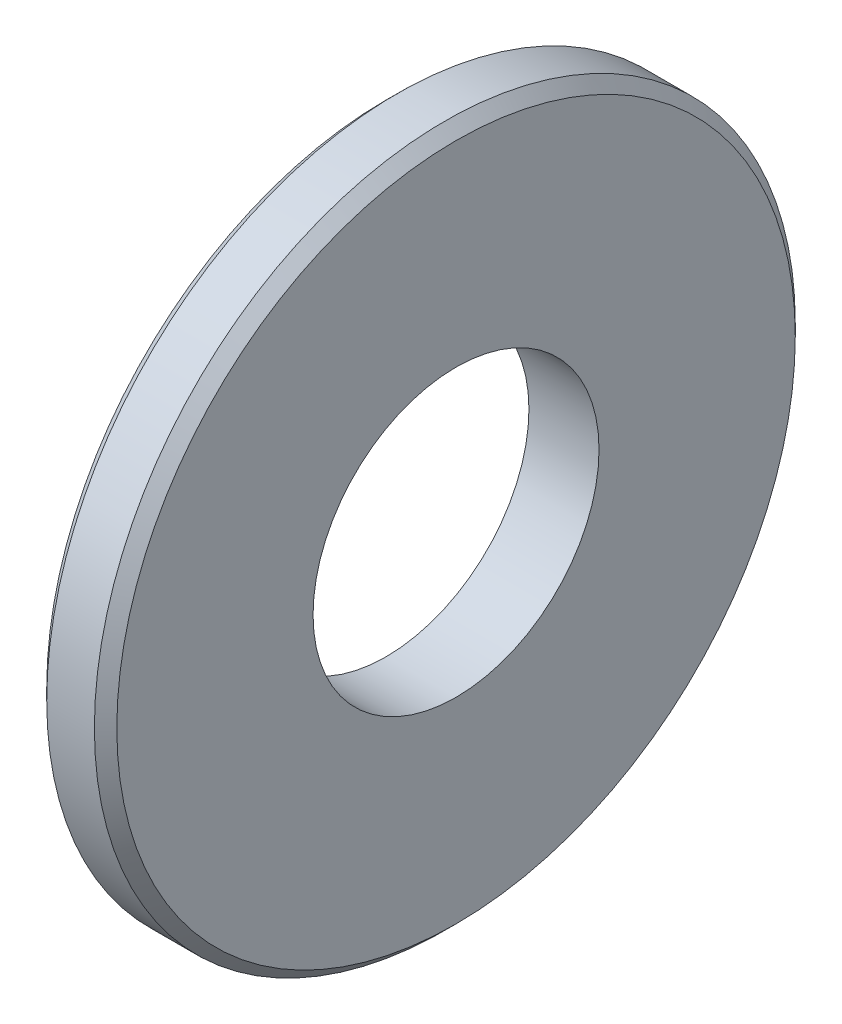
ISO-10303-21;
HEADER;
FILE_DESCRIPTION(('STEP AP214'),'2;1');
FILE_NAME('part.step','',(''),(''),'','','');
FILE_SCHEMA(('AUTOMOTIVE_DESIGN { 1 0 10303 214 1 1 1 1 }'));
ENDSEC;
DATA;
#1=APPLICATION_CONTEXT('core data for automotive mechanical design processes');
#2=APPLICATION_PROTOCOL_DEFINITION('international standard','automotive_design',2000,#1);
#3=PRODUCT_CONTEXT('',#1,'mechanical');
#4=PRODUCT('Part','Part','',(#3));
#5=PRODUCT_RELATED_PRODUCT_CATEGORY('part','',(#4));
#6=PRODUCT_DEFINITION_FORMATION('','',#4);
#7=PRODUCT_DEFINITION_CONTEXT('part definition',#1,'design');
#8=PRODUCT_DEFINITION('design','',#6,#7);
#9=PRODUCT_DEFINITION_SHAPE('','',#8);
#10=(LENGTH_UNIT() NAMED_UNIT(*) SI_UNIT(.MILLI.,.METRE.));
#11=(NAMED_UNIT(*) PLANE_ANGLE_UNIT() SI_UNIT($,.RADIAN.));
#12=(NAMED_UNIT(*) SI_UNIT($,.STERADIAN.) SOLID_ANGLE_UNIT());
#13=UNCERTAINTY_MEASURE_WITH_UNIT(LENGTH_MEASURE(1.E-05),#10,'distance_accuracy_value','');
#14=(GEOMETRIC_REPRESENTATION_CONTEXT(3) GLOBAL_UNCERTAINTY_ASSIGNED_CONTEXT((#13)) GLOBAL_UNIT_ASSIGNED_CONTEXT((#10,
#11,#12)) REPRESENTATION_CONTEXT('',''));
#15=CARTESIAN_POINT('',(0.,0.,0.));
#16=DIRECTION('',(0.,0.,1.));
#17=DIRECTION('',(1.,0.,0.));
#18=AXIS2_PLACEMENT_3D('',#15,#16,#17);
#19=CARTESIAN_POINT('',(1.5875,0.,0.));
#20=DIRECTION('',(1.,0.,0.));
#21=DIRECTION('',(0.,0.,-1.));
#22=AXIS2_PLACEMENT_3D('',#19,#20,#21);
#23=PLANE('',#22);
#24=CARTESIAN_POINT('',(1.5875,0.,0.));
#25=DIRECTION('',(1.,0.,0.));
#26=DIRECTION('',(0.,0.,-1.));
#27=AXIS2_PLACEMENT_3D('',#24,#25,#26);
#28=CIRCLE('',#27,7.6835);
#29=CARTESIAN_POINT('',(1.5875,0.,-7.6835));
#30=VERTEX_POINT('',#29);
#31=EDGE_CURVE('E10',#30,#30,#28,.T.);
#32=ORIENTED_EDGE('',*,*,#31,.T.);
#33=EDGE_LOOP('',(#32));
#34=FACE_BOUND('',#33,.T.);
#35=CARTESIAN_POINT('',(1.5875,0.,0.));
#36=DIRECTION('',(1.,0.,0.));
#37=DIRECTION('',(0.,0.,-1.));
#38=AXIS2_PLACEMENT_3D('',#35,#36,#37);
#39=CIRCLE('',#38,3.2385);
#40=CARTESIAN_POINT('',(1.5875,0.,-3.2385));
#41=VERTEX_POINT('',#40);
#42=EDGE_CURVE('E51',#41,#41,#39,.T.);
#43=ORIENTED_EDGE('',*,*,#42,.F.);
#44=EDGE_LOOP('',(#43));
#45=FACE_BOUND('',#44,.T.);
#46=ADVANCED_FACE('F31',(#34,#45),#23,.T.);
#47=CARTESIAN_POINT('',(0.,0.,0.));
#48=DIRECTION('',(1.,0.,0.));
#49=DIRECTION('',(0.,0.,-1.));
#50=AXIS2_PLACEMENT_3D('',#47,#48,#49);
#51=PLANE('',#50);
#52=CARTESIAN_POINT('',(0.,0.,0.));
#53=DIRECTION('',(1.,0.,0.));
#54=DIRECTION('',(0.,0.,-1.));
#55=AXIS2_PLACEMENT_3D('',#52,#53,#54);
#56=CIRCLE('',#55,7.6835);
#57=CARTESIAN_POINT('',(0.,0.,-7.6835));
#58=VERTEX_POINT('',#57);
#59=EDGE_CURVE('E38',#58,#58,#56,.F.);
#60=ORIENTED_EDGE('',*,*,#59,.T.);
#61=EDGE_LOOP('',(#60));
#62=FACE_BOUND('',#61,.T.);
#63=CARTESIAN_POINT('',(0.,0.,0.));
#64=DIRECTION('',(1.,0.,0.));
#65=DIRECTION('',(0.,0.,-1.));
#66=AXIS2_PLACEMENT_3D('',#63,#64,#65);
#67=CIRCLE('',#66,3.2385);
#68=CARTESIAN_POINT('',(0.,0.,-3.2385));
#69=VERTEX_POINT('',#68);
#70=EDGE_CURVE('E52',#69,#69,#67,.T.);
#71=ORIENTED_EDGE('',*,*,#70,.T.);
#72=EDGE_LOOP('',(#71));
#73=FACE_BOUND('',#72,.T.);
#74=ADVANCED_FACE('F62',(#62,#73),#51,.F.);
#75=CARTESIAN_POINT('',(1.5875,0.,0.));
#76=DIRECTION('',(-1.,0.,0.));
#77=DIRECTION('',(0.,0.,1.));
#78=AXIS2_PLACEMENT_3D('',#75,#76,#77);
#79=CYLINDRICAL_SURFACE('',#78,7.9375);
#80=CARTESIAN_POINT('',(0.254000000000003,0.,0.));
#81=DIRECTION('',(1.,0.,0.));
#82=DIRECTION('',(0.,0.,-1.));
#83=AXIS2_PLACEMENT_3D('',#80,#81,#82);
#84=CIRCLE('',#83,7.9375);
#85=CARTESIAN_POINT('',(0.254000000000003,0.,-7.9375));
#86=VERTEX_POINT('',#85);
#87=EDGE_CURVE('E42',#86,#86,#84,.T.);
#88=ORIENTED_EDGE('',*,*,#87,.T.);
#89=EDGE_LOOP('',(#88));
#90=FACE_BOUND('',#89,.T.);
#91=CARTESIAN_POINT('',(1.3335,0.,0.));
#92=DIRECTION('',(1.,0.,0.));
#93=DIRECTION('',(0.,0.,-1.));
#94=AXIS2_PLACEMENT_3D('',#91,#92,#93);
#95=CIRCLE('',#94,7.9375);
#96=CARTESIAN_POINT('',(1.3335,0.,-7.9375));
#97=VERTEX_POINT('',#96);
#98=EDGE_CURVE('E46',#97,#97,#95,.F.);
#99=ORIENTED_EDGE('',*,*,#98,.T.);
#100=EDGE_LOOP('',(#99));
#101=FACE_BOUND('',#100,.T.);
#102=ADVANCED_FACE('F67',(#90,#101),#79,.T.);
#103=CARTESIAN_POINT('',(1.5875,0.,0.));
#104=DIRECTION('',(-1.,0.,0.));
#105=DIRECTION('',(0.,0.,1.));
#106=AXIS2_PLACEMENT_3D('',#103,#104,#105);
#107=CYLINDRICAL_SURFACE('',#106,3.2385);
#108=ORIENTED_EDGE('',*,*,#42,.T.);
#109=EDGE_LOOP('',(#108));
#110=FACE_BOUND('',#109,.T.);
#111=ORIENTED_EDGE('',*,*,#70,.F.);
#112=EDGE_LOOP('',(#111));
#113=FACE_BOUND('',#112,.T.);
#114=ADVANCED_FACE('F58',(#110,#113),#107,.F.);
#115=CARTESIAN_POINT('',(0.254000000000003,0.,0.));
#116=DIRECTION('',(1.,0.,0.));
#117=DIRECTION('',(0.,0.,-1.));
#118=AXIS2_PLACEMENT_3D('',#115,#116,#117);
#119=CONICAL_SURFACE('',#118,7.9375,0.785398163397448);
#120=ORIENTED_EDGE('',*,*,#59,.F.);
#121=EDGE_LOOP('',(#120));
#122=FACE_BOUND('',#121,.T.);
#123=ORIENTED_EDGE('',*,*,#87,.F.);
#124=EDGE_LOOP('',(#123));
#125=FACE_BOUND('',#124,.T.);
#126=ADVANCED_FACE('F73',(#122,#125),#119,.T.);
#127=CARTESIAN_POINT('',(1.5875,0.,0.));
#128=DIRECTION('',(-1.,0.,0.));
#129=DIRECTION('',(0.,0.,1.));
#130=AXIS2_PLACEMENT_3D('',#127,#128,#129);
#131=CONICAL_SURFACE('',#130,7.6835,0.785398163397442);
#132=ORIENTED_EDGE('',*,*,#98,.F.);
#133=EDGE_LOOP('',(#132));
#134=FACE_BOUND('',#133,.T.);
#135=ORIENTED_EDGE('',*,*,#31,.F.);
#136=EDGE_LOOP('',(#135));
#137=FACE_BOUND('',#136,.T.);
#138=ADVANCED_FACE('F33',(#134,#137),#131,.T.);
#139=CLOSED_SHELL('',(#46,#74,#102,#114,#126,#138));
#140=MANIFOLD_SOLID_BREP('B2',#139);
#141=ADVANCED_BREP_SHAPE_REPRESENTATION('',(#18,#140),#14);
#142=SHAPE_DEFINITION_REPRESENTATION(#9,#141);
ENDSEC;
END-ISO-10303-21;
